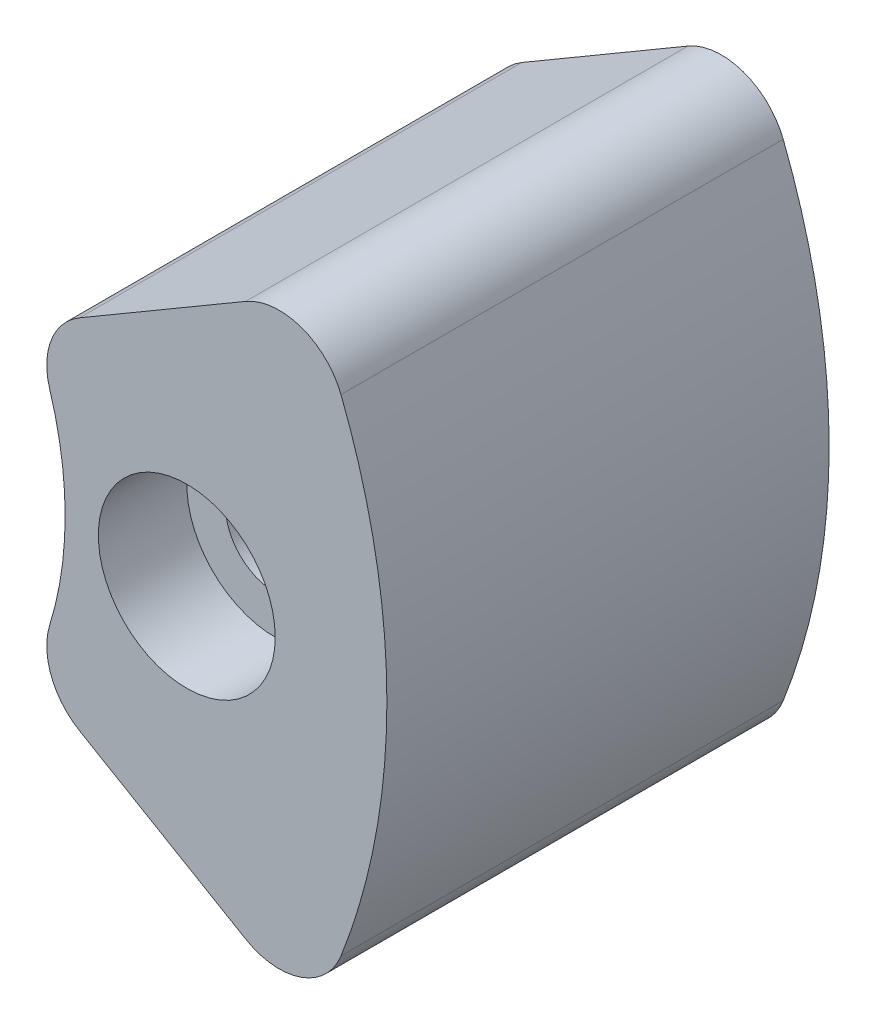
ISO-10303-21;
HEADER;
FILE_DESCRIPTION(('STEP AP214'),'2;1');
FILE_NAME('part.step','',(''),(''),'','','');
FILE_SCHEMA(('AUTOMOTIVE_DESIGN { 1 0 10303 214 1 1 1 1 }'));
ENDSEC;
DATA;
#1=APPLICATION_CONTEXT('core data for automotive mechanical design processes');
#2=APPLICATION_PROTOCOL_DEFINITION('international standard','automotive_design',2000,#1);
#3=PRODUCT_CONTEXT('',#1,'mechanical');
#4=PRODUCT('Part','Part','',(#3));
#5=PRODUCT_RELATED_PRODUCT_CATEGORY('part','',(#4));
#6=PRODUCT_DEFINITION_FORMATION('','',#4);
#7=PRODUCT_DEFINITION_CONTEXT('part definition',#1,'design');
#8=PRODUCT_DEFINITION('design','',#6,#7);
#9=PRODUCT_DEFINITION_SHAPE('','',#8);
#10=(LENGTH_UNIT() NAMED_UNIT(*) SI_UNIT(.MILLI.,.METRE.));
#11=(NAMED_UNIT(*) PLANE_ANGLE_UNIT() SI_UNIT($,.RADIAN.));
#12=(NAMED_UNIT(*) SI_UNIT($,.STERADIAN.) SOLID_ANGLE_UNIT());
#13=UNCERTAINTY_MEASURE_WITH_UNIT(LENGTH_MEASURE(1.E-05),#10,'distance_accuracy_value','');
#14=(GEOMETRIC_REPRESENTATION_CONTEXT(3) GLOBAL_UNCERTAINTY_ASSIGNED_CONTEXT((#13)) GLOBAL_UNIT_ASSIGNED_CONTEXT((#10,
#11,#12)) REPRESENTATION_CONTEXT('',''));
#15=CARTESIAN_POINT('',(0.,0.,0.));
#16=DIRECTION('',(0.,0.,1.));
#17=DIRECTION('',(1.,0.,0.));
#18=AXIS2_PLACEMENT_3D('',#15,#16,#17);
#19=CARTESIAN_POINT('',(25.280674437206,9.9,20.));
#20=DIRECTION('',(0.,0.,-1.));
#21=DIRECTION('',(-1.,0.,0.));
#22=AXIS2_PLACEMENT_3D('',#19,#20,#21);
#23=CYLINDRICAL_SURFACE('',#22,3.);
#24=CARTESIAN_POINT('',(25.280674437206,9.9,0.));
#25=DIRECTION('',(0.,0.,1.));
#26=DIRECTION('',(-1.,0.,0.));
#27=AXIS2_PLACEMENT_3D('',#24,#25,#26);
#28=CIRCLE('',#27,3.);
#29=CARTESIAN_POINT('',(28.0741191264,10.9939226519337,0.));
#30=VERTEX_POINT('',#29);
#31=CARTESIAN_POINT('',(23.7645025573319,12.4886720206853,0.));
#32=VERTEX_POINT('',#31);
#33=EDGE_CURVE('E141',#30,#32,#28,.T.);
#34=ORIENTED_EDGE('',*,*,#33,.T.);
#35=DIRECTION('',(0.,0.,-1.));
#36=VECTOR('',#35,1.);
#37=CARTESIAN_POINT('',(23.7645025573319,12.4886720206853,20.));
#38=LINE('',#37,#36);
#39=CARTESIAN_POINT('',(23.7645025573319,12.4886720206853,20.));
#40=VERTEX_POINT('',#39);
#41=EDGE_CURVE('E11',#40,#32,#38,.T.);
#42=ORIENTED_EDGE('',*,*,#41,.F.);
#43=CARTESIAN_POINT('',(25.280674437206,9.9,20.));
#44=DIRECTION('',(0.,0.,1.));
#45=DIRECTION('',(-1.,0.,0.));
#46=AXIS2_PLACEMENT_3D('',#43,#44,#45);
#47=CIRCLE('',#46,3.);
#48=CARTESIAN_POINT('',(28.0741191264,10.9939226519337,20.));
#49=VERTEX_POINT('',#48);
#50=EDGE_CURVE('E163',#49,#40,#47,.T.);
#51=ORIENTED_EDGE('',*,*,#50,.F.);
#52=DIRECTION('',(0.,0.,-1.));
#53=VECTOR('',#52,1.);
#54=CARTESIAN_POINT('',(28.0741191264,10.9939226519337,20.));
#55=LINE('',#54,#53);
#56=EDGE_CURVE('E137',#49,#30,#55,.T.);
#57=ORIENTED_EDGE('',*,*,#56,.T.);
#58=EDGE_LOOP('',(#34,#42,#51,#57));
#59=FACE_BOUND('',#58,.T.);
#60=ADVANCED_FACE('F39',(#59),#23,.T.);
#61=CARTESIAN_POINT('',(16.2520581951784,8.08867202068535,20.));
#62=DIRECTION('',(0.505390626624686,-0.862890673561783,0.));
#63=DIRECTION('',(0.862890673561783,0.505390626624686,0.));
#64=AXIS2_PLACEMENT_3D('',#61,#62,#63);
#65=PLANE('',#64);
#66=DIRECTION('',(-0.862890673561783,-0.505390626624686,0.));
#67=VECTOR('',#66,1.);
#68=CARTESIAN_POINT('',(16.2520581951784,8.08867202068535,0.));
#69=LINE('',#68,#67);
#70=CARTESIAN_POINT('',(16.2520581951784,8.08867202068535,0.));
#71=VERTEX_POINT('',#70);
#72=EDGE_CURVE('E145',#32,#71,#69,.T.);
#73=ORIENTED_EDGE('',*,*,#72,.T.);
#74=DIRECTION('',(0.,0.,-1.));
#75=VECTOR('',#74,1.);
#76=CARTESIAN_POINT('',(16.2520581951784,8.08867202068535,20.));
#77=LINE('',#76,#75);
#78=CARTESIAN_POINT('',(16.2520581951784,8.08867202068535,20.));
#79=VERTEX_POINT('',#78);
#80=EDGE_CURVE('E49',#79,#71,#77,.T.);
#81=ORIENTED_EDGE('',*,*,#80,.F.);
#82=DIRECTION('',(-0.862890673561783,-0.505390626624686,0.));
#83=VECTOR('',#82,1.);
#84=CARTESIAN_POINT('',(16.2520581951784,8.08867202068535,20.));
#85=LINE('',#84,#83);
#86=EDGE_CURVE('E100',#40,#79,#85,.T.);
#87=ORIENTED_EDGE('',*,*,#86,.F.);
#88=ORIENTED_EDGE('',*,*,#41,.T.);
#89=EDGE_LOOP('',(#73,#81,#87,#88));
#90=FACE_BOUND('',#89,.T.);
#91=ADVANCED_FACE('F236',(#90),#65,.F.);
#92=CARTESIAN_POINT('',(17.7682300750525,5.5,20.));
#93=DIRECTION('',(0.,0.,-1.));
#94=DIRECTION('',(-1.,0.,0.));
#95=AXIS2_PLACEMENT_3D('',#92,#93,#94);
#96=CYLINDRICAL_SURFACE('',#95,3.);
#97=CARTESIAN_POINT('',(17.7682300750525,5.5,0.));
#98=DIRECTION('',(0.,0.,1.));
#99=DIRECTION('',(1.,0.,0.));
#100=AXIS2_PLACEMENT_3D('',#97,#98,#99);
#101=CIRCLE('',#100,3.);
#102=CARTESIAN_POINT('',(14.9023865145602,4.61290322580645,0.));
#103=VERTEX_POINT('',#102);
#104=EDGE_CURVE('E148',#71,#103,#101,.T.);
#105=ORIENTED_EDGE('',*,*,#104,.T.);
#106=DIRECTION('',(0.,0.,-1.));
#107=VECTOR('',#106,1.);
#108=CARTESIAN_POINT('',(14.9023865145602,4.61290322580645,20.));
#109=LINE('',#108,#107);
#110=CARTESIAN_POINT('',(14.9023865145602,4.61290322580645,20.));
#111=VERTEX_POINT('',#110);
#112=EDGE_CURVE('E174',#111,#103,#109,.T.);
#113=ORIENTED_EDGE('',*,*,#112,.F.);
#114=CARTESIAN_POINT('',(17.7682300750525,5.5,20.));
#115=DIRECTION('',(0.,0.,1.));
#116=DIRECTION('',(1.,0.,0.));
#117=AXIS2_PLACEMENT_3D('',#114,#115,#116);
#118=CIRCLE('',#117,3.);
#119=EDGE_CURVE('E185',#79,#111,#118,.T.);
#120=ORIENTED_EDGE('',*,*,#119,.F.);
#121=ORIENTED_EDGE('',*,*,#80,.T.);
#122=EDGE_LOOP('',(#105,#113,#120,#121));
#123=FACE_BOUND('',#122,.T.);
#124=ADVANCED_FACE('F183',(#123),#96,.T.);
#125=CARTESIAN_POINT('',(0.,0.,20.));
#126=DIRECTION('',(0.,0.,-1.));
#127=DIRECTION('',(-1.,0.,0.));
#128=AXIS2_PLACEMENT_3D('',#125,#126,#127);
#129=CYLINDRICAL_SURFACE('',#128,15.6);
#130=CARTESIAN_POINT('',(0.,0.,0.));
#131=DIRECTION('',(0.,0.,-1.));
#132=DIRECTION('',(1.,0.,0.));
#133=AXIS2_PLACEMENT_3D('',#130,#131,#132);
#134=CIRCLE('',#133,15.6);
#135=CARTESIAN_POINT('',(14.9023865145602,-4.61290322580645,0.));
#136=VERTEX_POINT('',#135);
#137=EDGE_CURVE('E151',#103,#136,#134,.T.);
#138=ORIENTED_EDGE('',*,*,#137,.T.);
#139=DIRECTION('',(0.,0.,-1.));
#140=VECTOR('',#139,1.);
#141=CARTESIAN_POINT('',(14.9023865145602,-4.61290322580645,20.));
#142=LINE('',#141,#140);
#143=CARTESIAN_POINT('',(14.9023865145602,-4.61290322580645,20.));
#144=VERTEX_POINT('',#143);
#145=EDGE_CURVE('E170',#144,#136,#142,.T.);
#146=ORIENTED_EDGE('',*,*,#145,.F.);
#147=CARTESIAN_POINT('',(0.,0.,20.));
#148=DIRECTION('',(0.,0.,-1.));
#149=DIRECTION('',(1.,0.,0.));
#150=AXIS2_PLACEMENT_3D('',#147,#148,#149);
#151=CIRCLE('',#150,15.6);
#152=EDGE_CURVE('E198',#111,#144,#151,.T.);
#153=ORIENTED_EDGE('',*,*,#152,.F.);
#154=ORIENTED_EDGE('',*,*,#112,.T.);
#155=EDGE_LOOP('',(#138,#146,#153,#154));
#156=FACE_BOUND('',#155,.T.);
#157=ADVANCED_FACE('F193',(#156),#129,.F.);
#158=CARTESIAN_POINT('',(17.7682300750525,-5.5,20.));
#159=DIRECTION('',(0.,0.,-1.));
#160=DIRECTION('',(-1.,0.,0.));
#161=AXIS2_PLACEMENT_3D('',#158,#159,#160);
#162=CYLINDRICAL_SURFACE('',#161,3.);
#163=CARTESIAN_POINT('',(17.7682300750525,-5.5,0.));
#164=DIRECTION('',(0.,0.,1.));
#165=DIRECTION('',(-1.,0.,0.));
#166=AXIS2_PLACEMENT_3D('',#163,#164,#165);
#167=CIRCLE('',#166,3.);
#168=CARTESIAN_POINT('',(16.2520581951784,-8.08867202068535,0.));
#169=VERTEX_POINT('',#168);
#170=EDGE_CURVE('E154',#136,#169,#167,.T.);
#171=ORIENTED_EDGE('',*,*,#170,.T.);
#172=DIRECTION('',(0.,0.,-1.));
#173=VECTOR('',#172,1.);
#174=CARTESIAN_POINT('',(16.2520581951784,-8.08867202068535,20.));
#175=LINE('',#174,#173);
#176=CARTESIAN_POINT('',(16.2520581951784,-8.08867202068535,20.));
#177=VERTEX_POINT('',#176);
#178=EDGE_CURVE('E130',#177,#169,#175,.T.);
#179=ORIENTED_EDGE('',*,*,#178,.F.);
#180=CARTESIAN_POINT('',(17.7682300750525,-5.5,20.));
#181=DIRECTION('',(0.,0.,1.));
#182=DIRECTION('',(-1.,0.,0.));
#183=AXIS2_PLACEMENT_3D('',#180,#181,#182);
#184=CIRCLE('',#183,3.);
#185=EDGE_CURVE('E119',#144,#177,#184,.T.);
#186=ORIENTED_EDGE('',*,*,#185,.F.);
#187=ORIENTED_EDGE('',*,*,#145,.T.);
#188=EDGE_LOOP('',(#171,#179,#186,#187));
#189=FACE_BOUND('',#188,.T.);
#190=ADVANCED_FACE('F196',(#189),#162,.T.);
#191=CARTESIAN_POINT('',(16.2520581951784,-8.08867202068535,20.));
#192=DIRECTION('',(0.505390626624686,0.862890673561783,0.));
#193=DIRECTION('',(-0.862890673561783,0.505390626624686,0.));
#194=AXIS2_PLACEMENT_3D('',#191,#192,#193);
#195=PLANE('',#194);
#196=DIRECTION('',(0.862890673561783,-0.505390626624686,0.));
#197=VECTOR('',#196,1.);
#198=CARTESIAN_POINT('',(16.2520581951784,-8.08867202068535,0.));
#199=LINE('',#198,#197);
#200=CARTESIAN_POINT('',(23.7645025573319,-12.4886720206853,0.));
#201=VERTEX_POINT('',#200);
#202=EDGE_CURVE('E128',#169,#201,#199,.T.);
#203=ORIENTED_EDGE('',*,*,#202,.T.);
#204=DIRECTION('',(0.,0.,-1.));
#205=VECTOR('',#204,1.);
#206=CARTESIAN_POINT('',(23.7645025573319,-12.4886720206853,20.));
#207=LINE('',#206,#205);
#208=CARTESIAN_POINT('',(23.7645025573319,-12.4886720206853,20.));
#209=VERTEX_POINT('',#208);
#210=EDGE_CURVE('E125',#209,#201,#207,.T.);
#211=ORIENTED_EDGE('',*,*,#210,.F.);
#212=DIRECTION('',(0.862890673561783,-0.505390626624686,0.));
#213=VECTOR('',#212,1.);
#214=CARTESIAN_POINT('',(16.2520581951784,-8.08867202068535,20.));
#215=LINE('',#214,#213);
#216=EDGE_CURVE('E113',#177,#209,#215,.T.);
#217=ORIENTED_EDGE('',*,*,#216,.F.);
#218=ORIENTED_EDGE('',*,*,#178,.T.);
#219=EDGE_LOOP('',(#203,#211,#217,#218));
#220=FACE_BOUND('',#219,.T.);
#221=ADVANCED_FACE('F126',(#220),#195,.F.);
#222=CARTESIAN_POINT('',(25.280674437206,-9.9,20.));
#223=DIRECTION('',(0.,0.,-1.));
#224=DIRECTION('',(-1.,0.,0.));
#225=AXIS2_PLACEMENT_3D('',#222,#223,#224);
#226=CYLINDRICAL_SURFACE('',#225,3.);
#227=CARTESIAN_POINT('',(25.280674437206,-9.9,0.));
#228=DIRECTION('',(0.,0.,1.));
#229=DIRECTION('',(1.,0.,0.));
#230=AXIS2_PLACEMENT_3D('',#227,#228,#229);
#231=CIRCLE('',#230,3.);
#232=CARTESIAN_POINT('',(28.0741191264,-10.9939226519337,0.));
#233=VERTEX_POINT('',#232);
#234=EDGE_CURVE('E86',#201,#233,#231,.T.);
#235=ORIENTED_EDGE('',*,*,#234,.T.);
#236=DIRECTION('',(0.,0.,-1.));
#237=VECTOR('',#236,1.);
#238=CARTESIAN_POINT('',(28.0741191264,-10.9939226519337,20.));
#239=LINE('',#238,#237);
#240=CARTESIAN_POINT('',(28.0741191264,-10.9939226519337,20.));
#241=VERTEX_POINT('',#240);
#242=EDGE_CURVE('E131',#241,#233,#239,.T.);
#243=ORIENTED_EDGE('',*,*,#242,.F.);
#244=CARTESIAN_POINT('',(25.280674437206,-9.9,20.));
#245=DIRECTION('',(0.,0.,1.));
#246=DIRECTION('',(1.,0.,0.));
#247=AXIS2_PLACEMENT_3D('',#244,#245,#246);
#248=CIRCLE('',#247,3.);
#249=EDGE_CURVE('E117',#209,#241,#248,.T.);
#250=ORIENTED_EDGE('',*,*,#249,.F.);
#251=ORIENTED_EDGE('',*,*,#210,.T.);
#252=EDGE_LOOP('',(#235,#243,#250,#251));
#253=FACE_BOUND('',#252,.T.);
#254=ADVANCED_FACE('F133',(#253),#226,.T.);
#255=CARTESIAN_POINT('',(0.,0.,20.));
#256=DIRECTION('',(0.,0.,-1.));
#257=DIRECTION('',(-1.,0.,0.));
#258=AXIS2_PLACEMENT_3D('',#255,#256,#257);
#259=CYLINDRICAL_SURFACE('',#258,30.15);
#260=CARTESIAN_POINT('',(0.,0.,0.));
#261=DIRECTION('',(0.,0.,1.));
#262=DIRECTION('',(1.,0.,0.));
#263=AXIS2_PLACEMENT_3D('',#260,#261,#262);
#264=CIRCLE('',#263,30.15);
#265=EDGE_CURVE('E92',#233,#30,#264,.T.);
#266=ORIENTED_EDGE('',*,*,#265,.T.);
#267=ORIENTED_EDGE('',*,*,#56,.F.);
#268=CARTESIAN_POINT('',(0.,0.,20.));
#269=DIRECTION('',(0.,0.,1.));
#270=DIRECTION('',(1.,0.,0.));
#271=AXIS2_PLACEMENT_3D('',#268,#269,#270);
#272=CIRCLE('',#271,30.15);
#273=EDGE_CURVE('E57',#241,#49,#272,.T.);
#274=ORIENTED_EDGE('',*,*,#273,.F.);
#275=ORIENTED_EDGE('',*,*,#242,.T.);
#276=EDGE_LOOP('',(#266,#267,#274,#275));
#277=FACE_BOUND('',#276,.T.);
#278=ADVANCED_FACE('F224',(#277),#259,.T.);
#279=CARTESIAN_POINT('',(25.280674437206,9.9,20.));
#280=DIRECTION('',(0.,0.,-1.));
#281=DIRECTION('',(-1.,0.,0.));
#282=AXIS2_PLACEMENT_3D('',#279,#280,#281);
#283=PLANE('',#282);
#284=CARTESIAN_POINT('',(21.1,0.,20.));
#285=DIRECTION('',(0.,0.,1.));
#286=DIRECTION('',(1.,0.,0.));
#287=AXIS2_PLACEMENT_3D('',#284,#285,#286);
#288=CIRCLE('',#287,3.99999999999999);
#289=CARTESIAN_POINT('',(25.1,0.,20.));
#290=VERTEX_POINT('',#289);
#291=EDGE_CURVE('E216',#290,#290,#288,.T.);
#292=ORIENTED_EDGE('',*,*,#291,.F.);
#293=EDGE_LOOP('',(#292));
#294=FACE_BOUND('',#293,.T.);
#295=ORIENTED_EDGE('',*,*,#50,.T.);
#296=ORIENTED_EDGE('',*,*,#86,.T.);
#297=ORIENTED_EDGE('',*,*,#119,.T.);
#298=ORIENTED_EDGE('',*,*,#152,.T.);
#299=ORIENTED_EDGE('',*,*,#185,.T.);
#300=ORIENTED_EDGE('',*,*,#216,.T.);
#301=ORIENTED_EDGE('',*,*,#249,.T.);
#302=ORIENTED_EDGE('',*,*,#273,.T.);
#303=EDGE_LOOP('',(#295,#296,#297,#298,#299,#300,#301,#302));
#304=FACE_BOUND('',#303,.T.);
#305=ADVANCED_FACE('F115',(#294,#304),#283,.F.);
#306=CARTESIAN_POINT('',(25.280674437206,9.9,0.));
#307=DIRECTION('',(0.,0.,-1.));
#308=DIRECTION('',(-1.,0.,0.));
#309=AXIS2_PLACEMENT_3D('',#306,#307,#308);
#310=PLANE('',#309);
#311=CARTESIAN_POINT('',(21.1,0.,0.));
#312=DIRECTION('',(0.,0.,-1.));
#313=DIRECTION('',(-1.,0.,0.));
#314=AXIS2_PLACEMENT_3D('',#311,#312,#313);
#315=CIRCLE('',#314,2.24999999999999);
#316=CARTESIAN_POINT('',(18.85,0.,0.));
#317=VERTEX_POINT('',#316);
#318=EDGE_CURVE('E42',#317,#317,#315,.T.);
#319=ORIENTED_EDGE('',*,*,#318,.F.);
#320=EDGE_LOOP('',(#319));
#321=FACE_BOUND('',#320,.T.);
#322=ORIENTED_EDGE('',*,*,#33,.F.);
#323=ORIENTED_EDGE('',*,*,#265,.F.);
#324=ORIENTED_EDGE('',*,*,#234,.F.);
#325=ORIENTED_EDGE('',*,*,#202,.F.);
#326=ORIENTED_EDGE('',*,*,#170,.F.);
#327=ORIENTED_EDGE('',*,*,#137,.F.);
#328=ORIENTED_EDGE('',*,*,#104,.F.);
#329=ORIENTED_EDGE('',*,*,#72,.F.);
#330=EDGE_LOOP('',(#322,#323,#324,#325,#326,#327,#328,#329));
#331=FACE_BOUND('',#330,.T.);
#332=ADVANCED_FACE('F189',(#321,#331),#310,.T.);
#333=CARTESIAN_POINT('',(21.1,0.,20.));
#334=DIRECTION('',(0.,0.,1.));
#335=DIRECTION('',(1.,0.,0.));
#336=AXIS2_PLACEMENT_3D('',#333,#334,#335);
#337=CYLINDRICAL_SURFACE('',#336,2.24999999999999);
#338=ORIENTED_EDGE('',*,*,#318,.T.);
#339=EDGE_LOOP('',(#338));
#340=FACE_BOUND('',#339,.T.);
#341=CARTESIAN_POINT('',(21.1,0.,16.));
#342=DIRECTION('',(0.,0.,1.));
#343=DIRECTION('',(1.,0.,0.));
#344=AXIS2_PLACEMENT_3D('',#341,#342,#343);
#345=CIRCLE('',#344,2.25);
#346=CARTESIAN_POINT('',(23.35,0.,16.));
#347=VERTEX_POINT('',#346);
#348=EDGE_CURVE('E208',#347,#347,#345,.T.);
#349=ORIENTED_EDGE('',*,*,#348,.T.);
#350=EDGE_LOOP('',(#349));
#351=FACE_BOUND('',#350,.T.);
#352=ADVANCED_FACE('F230',(#340,#351),#337,.F.);
#353=CARTESIAN_POINT('',(23.35,0.,16.));
#354=DIRECTION('',(0.,0.,-1.));
#355=DIRECTION('',(-1.,0.,0.));
#356=AXIS2_PLACEMENT_3D('',#353,#354,#355);
#357=PLANE('',#356);
#358=ORIENTED_EDGE('',*,*,#348,.F.);
#359=EDGE_LOOP('',(#358));
#360=FACE_BOUND('',#359,.T.);
#361=CARTESIAN_POINT('',(21.1,0.,16.));
#362=DIRECTION('',(0.,0.,1.));
#363=DIRECTION('',(1.,0.,0.));
#364=AXIS2_PLACEMENT_3D('',#361,#362,#363);
#365=CIRCLE('',#364,4.);
#366=CARTESIAN_POINT('',(25.1,0.,16.));
#367=VERTEX_POINT('',#366);
#368=EDGE_CURVE('E212',#367,#367,#365,.T.);
#369=ORIENTED_EDGE('',*,*,#368,.T.);
#370=EDGE_LOOP('',(#369));
#371=FACE_BOUND('',#370,.T.);
#372=ADVANCED_FACE('F282',(#360,#371),#357,.F.);
#373=CARTESIAN_POINT('',(21.1,0.,20.));
#374=DIRECTION('',(0.,0.,1.));
#375=DIRECTION('',(1.,0.,0.));
#376=AXIS2_PLACEMENT_3D('',#373,#374,#375);
#377=CYLINDRICAL_SURFACE('',#376,3.99999999999999);
#378=ORIENTED_EDGE('',*,*,#368,.F.);
#379=EDGE_LOOP('',(#378));
#380=FACE_BOUND('',#379,.T.);
#381=ORIENTED_EDGE('',*,*,#291,.T.);
#382=EDGE_LOOP('',(#381));
#383=FACE_BOUND('',#382,.T.);
#384=ADVANCED_FACE('F221',(#380,#383),#377,.F.);
#385=CLOSED_SHELL('',(#60,#91,#124,#157,#190,#221,#254,#278,#305,#332,#352,#372,#384));
#386=MANIFOLD_SOLID_BREP('B2',#385);
#387=ADVANCED_BREP_SHAPE_REPRESENTATION('',(#18,#386),#14);
#388=SHAPE_DEFINITION_REPRESENTATION(#9,#387);
ENDSEC;
END-ISO-10303-21;
